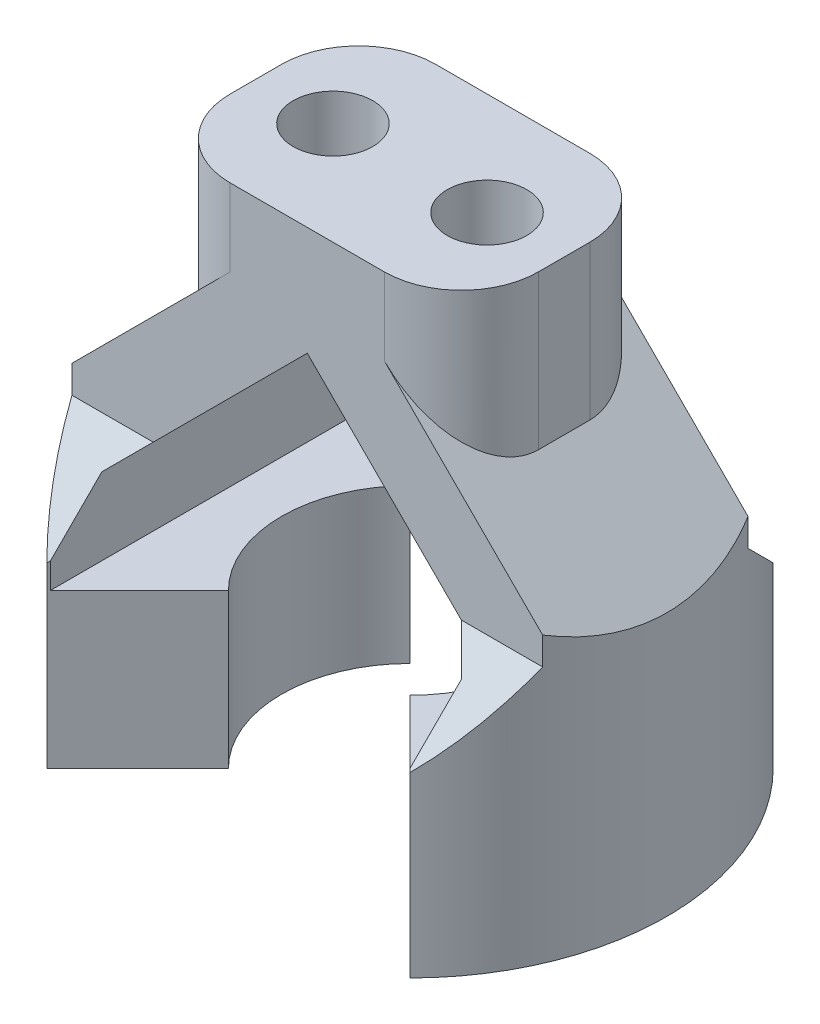
ISO-10303-21;
HEADER;
FILE_DESCRIPTION(('STEP AP214'),'2;1');
FILE_NAME('part.step','',(''),(''),'','','');
FILE_SCHEMA(('AUTOMOTIVE_DESIGN { 1 0 10303 214 1 1 1 1 }'));
ENDSEC;
DATA;
#1=APPLICATION_CONTEXT('core data for automotive mechanical design processes');
#2=APPLICATION_PROTOCOL_DEFINITION('international standard','automotive_design',2000,#1);
#3=PRODUCT_CONTEXT('',#1,'mechanical');
#4=PRODUCT('Part','Part','',(#3));
#5=PRODUCT_RELATED_PRODUCT_CATEGORY('part','',(#4));
#6=PRODUCT_DEFINITION_FORMATION('','',#4);
#7=PRODUCT_DEFINITION_CONTEXT('part definition',#1,'design');
#8=PRODUCT_DEFINITION('design','',#6,#7);
#9=PRODUCT_DEFINITION_SHAPE('','',#8);
#10=(LENGTH_UNIT() NAMED_UNIT(*) SI_UNIT(.MILLI.,.METRE.));
#11=(NAMED_UNIT(*) PLANE_ANGLE_UNIT() SI_UNIT($,.RADIAN.));
#12=(NAMED_UNIT(*) SI_UNIT($,.STERADIAN.) SOLID_ANGLE_UNIT());
#13=UNCERTAINTY_MEASURE_WITH_UNIT(LENGTH_MEASURE(1.E-05),#10,'distance_accuracy_value','');
#14=(GEOMETRIC_REPRESENTATION_CONTEXT(3) GLOBAL_UNCERTAINTY_ASSIGNED_CONTEXT((#13)) GLOBAL_UNIT_ASSIGNED_CONTEXT((#10,
#11,#12)) REPRESENTATION_CONTEXT('',''));
#15=CARTESIAN_POINT('',(0.,0.,0.));
#16=DIRECTION('',(0.,0.,1.));
#17=DIRECTION('',(1.,0.,0.));
#18=AXIS2_PLACEMENT_3D('',#15,#16,#17);
#19=CARTESIAN_POINT('',(0.,6.,0.));
#20=DIRECTION('',(0.,1.,0.));
#21=DIRECTION('',(0.,0.,1.));
#22=AXIS2_PLACEMENT_3D('',#19,#20,#21);
#23=PLANE('',#22);
#24=CARTESIAN_POINT('',(0.,6.,0.));
#25=DIRECTION('',(0.,1.,0.));
#26=DIRECTION('',(0.,0.,1.));
#27=AXIS2_PLACEMENT_3D('',#24,#25,#26);
#28=CIRCLE('',#27,5.);
#29=CARTESIAN_POINT('',(-3.53553390593274,6.,-3.53553390593273));
#30=VERTEX_POINT('',#29);
#31=CARTESIAN_POINT('',(-3.53553390593274,6.,3.53553390593273));
#32=VERTEX_POINT('',#31);
#33=EDGE_CURVE('E389',#30,#32,#28,.T.);
#34=ORIENTED_EDGE('',*,*,#33,.F.);
#35=DIRECTION('',(-0.707106781186549,0.,-0.707106781186546));
#36=VECTOR('',#35,1.);
#37=CARTESIAN_POINT('',(0.,6.,0.));
#38=LINE('',#37,#36);
#39=CARTESIAN_POINT('',(-7.,6.,-6.99999999999998));
#40=VERTEX_POINT('',#39);
#41=EDGE_CURVE('E582',#30,#40,#38,.T.);
#42=ORIENTED_EDGE('',*,*,#41,.T.);
#43=DIRECTION('',(0.,0.,-1.));
#44=VECTOR('',#43,1.);
#45=CARTESIAN_POINT('',(-7.,6.,4.));
#46=LINE('',#45,#44);
#47=CARTESIAN_POINT('',(-7.,6.,6.99999999999998));
#48=VERTEX_POINT('',#47);
#49=EDGE_CURVE('E257',#48,#40,#46,.T.);
#50=ORIENTED_EDGE('',*,*,#49,.F.);
#51=DIRECTION('',(-0.707106781186549,0.,0.707106781186546));
#52=VECTOR('',#51,1.);
#53=CARTESIAN_POINT('',(0.,6.,0.));
#54=LINE('',#53,#52);
#55=EDGE_CURVE('E469',#32,#48,#54,.T.);
#56=ORIENTED_EDGE('',*,*,#55,.F.);
#57=EDGE_LOOP('',(#34,#42,#50,#56));
#58=FACE_BOUND('',#57,.T.);
#59=ADVANCED_FACE('F47',(#58),#23,.T.);
#60=CARTESIAN_POINT('',(0.,0.,0.));
#61=DIRECTION('',(0.,1.,0.));
#62=DIRECTION('',(0.,0.,1.));
#63=AXIS2_PLACEMENT_3D('',#60,#61,#62);
#64=PLANE('',#63);
#65=DIRECTION('',(-0.707106781186549,0.,-0.707106781186546));
#66=VECTOR('',#65,1.);
#67=CARTESIAN_POINT('',(0.,0.,0.));
#68=LINE('',#67,#66);
#69=CARTESIAN_POINT('',(-3.53553390593274,0.,-3.53553390593273));
#70=VERTEX_POINT('',#69);
#71=CARTESIAN_POINT('',(-7.07106781186549,0.,-7.07106781186546));
#72=VERTEX_POINT('',#71);
#73=EDGE_CURVE('E583',#70,#72,#68,.T.);
#74=ORIENTED_EDGE('',*,*,#73,.F.);
#75=CARTESIAN_POINT('',(0.,0.,0.));
#76=DIRECTION('',(0.,1.,0.));
#77=DIRECTION('',(0.,0.,1.));
#78=AXIS2_PLACEMENT_3D('',#75,#76,#77);
#79=CIRCLE('',#78,5.);
#80=CARTESIAN_POINT('',(-3.53553390593274,0.,3.53553390593273));
#81=VERTEX_POINT('',#80);
#82=EDGE_CURVE('E383',#70,#81,#79,.T.);
#83=ORIENTED_EDGE('',*,*,#82,.T.);
#84=DIRECTION('',(-0.707106781186549,0.,0.707106781186546));
#85=VECTOR('',#84,1.);
#86=CARTESIAN_POINT('',(0.,0.,0.));
#87=LINE('',#86,#85);
#88=CARTESIAN_POINT('',(-7.07106781186549,0.,7.07106781186546));
#89=VERTEX_POINT('',#88);
#90=EDGE_CURVE('E468',#81,#89,#87,.T.);
#91=ORIENTED_EDGE('',*,*,#90,.T.);
#92=CARTESIAN_POINT('',(0.,0.,0.));
#93=DIRECTION('',(0.,1.,0.));
#94=DIRECTION('',(0.,0.,1.));
#95=AXIS2_PLACEMENT_3D('',#92,#93,#94);
#96=CIRCLE('',#95,10.);
#97=EDGE_CURVE('E388',#72,#89,#96,.T.);
#98=ORIENTED_EDGE('',*,*,#97,.F.);
#99=EDGE_LOOP('',(#74,#83,#91,#98));
#100=FACE_BOUND('',#99,.T.);
#101=ADVANCED_FACE('F619',(#100),#64,.F.);
#102=CARTESIAN_POINT('',(0.,6.,0.));
#103=DIRECTION('',(0.,-1.,0.));
#104=DIRECTION('',(0.,0.,-1.));
#105=AXIS2_PLACEMENT_3D('',#102,#103,#104);
#106=CYLINDRICAL_SURFACE('',#105,10.);
#107=DIRECTION('',(0.,1.,0.));
#108=VECTOR('',#107,1.);
#109=CARTESIAN_POINT('',(-7.07106781186549,0.,-7.07106781186546));
#110=LINE('',#109,#108);
#111=CARTESIAN_POINT('',(-7.07106781186549,6.92893218813458,-7.07106781186546));
#112=VERTEX_POINT('',#111);
#113=EDGE_CURVE('E243',#72,#112,#110,.T.);
#114=ORIENTED_EDGE('',*,*,#113,.F.);
#115=ORIENTED_EDGE('',*,*,#97,.T.);
#116=DIRECTION('',(0.,1.,0.));
#117=VECTOR('',#116,1.);
#118=CARTESIAN_POINT('',(-7.07106781186549,0.,7.07106781186546));
#119=LINE('',#118,#117);
#120=CARTESIAN_POINT('',(-7.07106781186549,6.9289321881346,7.07106781186546));
#121=VERTEX_POINT('',#120);
#122=EDGE_CURVE('E483',#89,#121,#119,.T.);
#123=ORIENTED_EDGE('',*,*,#122,.T.);
#124=CARTESIAN_POINT('',(0.,14.,0.));
#125=DIRECTION('',(0.,0.707106781186551,0.707106781186544));
#126=DIRECTION('',(0.,-0.707106781186544,0.707106781186551));
#127=AXIS2_PLACEMENT_3D('',#124,#125,#126);
#128=ELLIPSE('',#127,14.1421356237309,10.);
#129=CARTESIAN_POINT('',(-9.16515138991168,10.,4.));
#130=VERTEX_POINT('',#129);
#131=EDGE_CURVE('E435',#121,#130,#128,.F.);
#132=ORIENTED_EDGE('',*,*,#131,.T.);
#133=DIRECTION('',(0.,-1.,0.));
#134=VECTOR('',#133,1.);
#135=CARTESIAN_POINT('',(-9.16515138991168,20.2436406871193,4.));
#136=LINE('',#135,#134);
#137=CARTESIAN_POINT('',(-9.16515138991168,11.0774892972076,4.));
#138=VERTEX_POINT('',#137);
#139=EDGE_CURVE('E482',#138,#130,#136,.T.);
#140=ORIENTED_EDGE('',*,*,#139,.F.);
#141=CARTESIAN_POINT('',(0.,20.2426406871193,0.));
#142=DIRECTION('',(-0.707106781186547,0.707106781186547,0.));
#143=DIRECTION('',(-0.707106781186548,-0.707106781186548,0.));
#144=AXIS2_PLACEMENT_3D('',#141,#142,#143);
#145=ELLIPSE('',#144,14.142135623731,10.);
#146=CARTESIAN_POINT('',(-9.16515138991168,11.0774892972076,-4.));
#147=VERTEX_POINT('',#146);
#148=EDGE_CURVE('E503',#147,#138,#145,.T.);
#149=ORIENTED_EDGE('',*,*,#148,.F.);
#150=DIRECTION('',(0.,-1.,0.));
#151=VECTOR('',#150,1.);
#152=CARTESIAN_POINT('',(-9.16515138991168,20.2436406871193,-4.));
#153=LINE('',#152,#151);
#154=CARTESIAN_POINT('',(-9.16515138991168,10.0000000000001,-4.));
#155=VERTEX_POINT('',#154);
#156=EDGE_CURVE('E497',#147,#155,#153,.T.);
#157=ORIENTED_EDGE('',*,*,#156,.T.);
#158=CARTESIAN_POINT('',(0.,14.0000000000001,0.));
#159=DIRECTION('',(0.,-0.707106781186544,0.707106781186551));
#160=DIRECTION('',(0.,-0.707106781186551,-0.707106781186544));
#161=AXIS2_PLACEMENT_3D('',#158,#159,#160);
#162=ELLIPSE('',#161,14.142135623731,10.);
#163=EDGE_CURVE('E266',#155,#112,#162,.T.);
#164=ORIENTED_EDGE('',*,*,#163,.T.);
#165=EDGE_LOOP('',(#114,#115,#123,#132,#140,#149,#157,#164));
#166=FACE_BOUND('',#165,.T.);
#167=ADVANCED_FACE('F552',(#166),#106,.T.);
#168=CARTESIAN_POINT('',(0.,6.,0.));
#169=DIRECTION('',(0.,-1.,0.));
#170=DIRECTION('',(0.,0.,-1.));
#171=AXIS2_PLACEMENT_3D('',#168,#169,#170);
#172=CYLINDRICAL_SURFACE('',#171,5.);
#173=ORIENTED_EDGE('',*,*,#82,.F.);
#174=DIRECTION('',(0.,1.,0.));
#175=VECTOR('',#174,1.);
#176=CARTESIAN_POINT('',(-3.53553390593274,0.,-3.53553390593273));
#177=LINE('',#176,#175);
#178=EDGE_CURVE('E591',#70,#30,#177,.T.);
#179=ORIENTED_EDGE('',*,*,#178,.T.);
#180=ORIENTED_EDGE('',*,*,#33,.T.);
#181=DIRECTION('',(0.,1.,0.));
#182=VECTOR('',#181,1.);
#183=CARTESIAN_POINT('',(-3.53553390593274,0.,3.53553390593273));
#184=LINE('',#183,#182);
#185=EDGE_CURVE('E486',#81,#32,#184,.T.);
#186=ORIENTED_EDGE('',*,*,#185,.F.);
#187=EDGE_LOOP('',(#173,#179,#180,#186));
#188=FACE_BOUND('',#187,.T.);
#189=ADVANCED_FACE('F609',(#188),#172,.F.);
#190=CARTESIAN_POINT('',(-7.,0.,4.));
#191=DIRECTION('',(-1.,0.,0.));
#192=DIRECTION('',(0.,-1.,0.));
#193=AXIS2_PLACEMENT_3D('',#190,#191,#192);
#194=PLANE('',#193);
#195=DIRECTION('',(0.,-1.,0.));
#196=VECTOR('',#195,1.);
#197=CARTESIAN_POINT('',(-7.,20.2436406871193,-6.99999999999998));
#198=LINE('',#197,#196);
#199=CARTESIAN_POINT('',(-7.,7.00000000000006,-6.99999999999998));
#200=VERTEX_POINT('',#199);
#201=EDGE_CURVE('E240',#200,#40,#198,.T.);
#202=ORIENTED_EDGE('',*,*,#201,.F.);
#203=DIRECTION('',(0.,0.707106781186551,0.707106781186544));
#204=VECTOR('',#203,1.);
#205=CARTESIAN_POINT('',(-7.,8.99999999999998,-5.00000000000008));
#206=LINE('',#205,#204);
#207=CARTESIAN_POINT('',(-7.,9.,-5.00000000000006));
#208=VERTEX_POINT('',#207);
#209=EDGE_CURVE('E253',#200,#208,#206,.T.);
#210=ORIENTED_EDGE('',*,*,#209,.T.);
#211=DIRECTION('',(0.,0.,-1.));
#212=VECTOR('',#211,1.);
#213=CARTESIAN_POINT('',(-7.,9.,4.));
#214=LINE('',#213,#212);
#215=CARTESIAN_POINT('',(-7.,9.,5.00000000000004));
#216=VERTEX_POINT('',#215);
#217=EDGE_CURVE('E378',#216,#208,#214,.T.);
#218=ORIENTED_EDGE('',*,*,#217,.F.);
#219=DIRECTION('',(0.,0.707106781186544,-0.707106781186551));
#220=VECTOR('',#219,1.);
#221=CARTESIAN_POINT('',(-7.,5.00000000000006,9.00000000000001));
#222=LINE('',#221,#220);
#223=CARTESIAN_POINT('',(-7.,7.00000000000007,6.99999999999998));
#224=VERTEX_POINT('',#223);
#225=EDGE_CURVE('E272',#216,#224,#222,.F.);
#226=ORIENTED_EDGE('',*,*,#225,.T.);
#227=DIRECTION('',(0.,-1.,0.));
#228=VECTOR('',#227,1.);
#229=CARTESIAN_POINT('',(-7.,20.2436406871193,6.99999999999998));
#230=LINE('',#229,#228);
#231=EDGE_CURVE('E444',#224,#48,#230,.T.);
#232=ORIENTED_EDGE('',*,*,#231,.T.);
#233=ORIENTED_EDGE('',*,*,#49,.T.);
#234=EDGE_LOOP('',(#202,#210,#218,#226,#232,#233));
#235=FACE_BOUND('',#234,.T.);
#236=ADVANCED_FACE('F252',(#235),#194,.F.);
#237=CARTESIAN_POINT('',(0.,10.0000000000001,-4.));
#238=DIRECTION('',(0.,-0.707106781186544,0.707106781186551));
#239=DIRECTION('',(-1.,0.,0.));
#240=AXIS2_PLACEMENT_3D('',#237,#238,#239);
#241=PLANE('',#240);
#242=DIRECTION('',(0.577350269189625,0.577350269189629,0.577350269189623));
#243=VECTOR('',#242,1.);
#244=CARTESIAN_POINT('',(2.08121356237307,16.0812135623732,2.08121356237306));
#245=LINE('',#244,#243);
#246=EDGE_CURVE('E237',#112,#200,#245,.T.);
#247=ORIENTED_EDGE('',*,*,#246,.F.);
#248=ORIENTED_EDGE('',*,*,#163,.F.);
#249=DIRECTION('',(-1.,0.,0.));
#250=VECTOR('',#249,1.);
#251=CARTESIAN_POINT('',(0.,10.0000000000001,-4.));
#252=LINE('',#251,#250);
#253=CARTESIAN_POINT('',(-5.99999999999993,10.0000000000001,-4.));
#254=VERTEX_POINT('',#253);
#255=EDGE_CURVE('E398',#254,#155,#252,.T.);
#256=ORIENTED_EDGE('',*,*,#255,.F.);
#257=DIRECTION('',(0.577350269189628,0.577350269189628,0.577350269189622));
#258=VECTOR('',#257,1.);
#259=CARTESIAN_POINT('',(-4.66666666666666,11.3333333333333,-2.66666666666675));
#260=LINE('',#259,#258);
#261=EDGE_CURVE('E264',#208,#254,#260,.T.);
#262=ORIENTED_EDGE('',*,*,#261,.F.);
#263=ORIENTED_EDGE('',*,*,#209,.F.);
#264=EDGE_LOOP('',(#247,#248,#256,#262,#263));
#265=FACE_BOUND('',#264,.T.);
#266=ADVANCED_FACE('F262',(#265),#241,.F.);
#267=DIRECTION('',(0.707106781186549,0.,-0.707106781186546));
#268=VECTOR('',#267,1.);
#269=CARTESIAN_POINT('',(0.,6.,0.));
#270=LINE('',#269,#268);
#271=CARTESIAN_POINT('',(3.53553390593274,6.,-3.53553390593273));
#272=VERTEX_POINT('',#271);
#273=CARTESIAN_POINT('',(7.,6.,-6.99999999999998));
#274=VERTEX_POINT('',#273);
#275=EDGE_CURVE('E587',#272,#274,#270,.T.);
#276=ORIENTED_EDGE('',*,*,#275,.F.);
#277=CARTESIAN_POINT('',(3.53553390593274,6.,3.53553390593273));
#278=VERTEX_POINT('',#277);
#279=EDGE_CURVE('E384',#278,#272,#28,.T.);
#280=ORIENTED_EDGE('',*,*,#279,.F.);
#281=DIRECTION('',(0.707106781186549,0.,0.707106781186546));
#282=VECTOR('',#281,1.);
#283=CARTESIAN_POINT('',(0.,6.,0.));
#284=LINE('',#283,#282);
#285=CARTESIAN_POINT('',(7.,6.,6.99999999999998));
#286=VERTEX_POINT('',#285);
#287=EDGE_CURVE('E459',#278,#286,#284,.T.);
#288=ORIENTED_EDGE('',*,*,#287,.T.);
#289=DIRECTION('',(0.,0.,-1.));
#290=VECTOR('',#289,1.);
#291=CARTESIAN_POINT('',(7.,6.,4.));
#292=LINE('',#291,#290);
#293=EDGE_CURVE('E367',#286,#274,#292,.T.);
#294=ORIENTED_EDGE('',*,*,#293,.T.);
#295=EDGE_LOOP('',(#276,#280,#288,#294));
#296=FACE_BOUND('',#295,.T.);
#297=ADVANCED_FACE('F642',(#296),#23,.T.);
#298=CARTESIAN_POINT('',(3.53553390593274,0.,3.53553390593273));
#299=VERTEX_POINT('',#298);
#300=CARTESIAN_POINT('',(3.53553390593274,0.,-3.53553390593273));
#301=VERTEX_POINT('',#300);
#302=EDGE_CURVE('E390',#299,#301,#79,.T.);
#303=ORIENTED_EDGE('',*,*,#302,.T.);
#304=DIRECTION('',(0.707106781186549,0.,-0.707106781186546));
#305=VECTOR('',#304,1.);
#306=CARTESIAN_POINT('',(0.,0.,0.));
#307=LINE('',#306,#305);
#308=CARTESIAN_POINT('',(7.07106781186549,0.,-7.07106781186546));
#309=VERTEX_POINT('',#308);
#310=EDGE_CURVE('E586',#301,#309,#307,.T.);
#311=ORIENTED_EDGE('',*,*,#310,.T.);
#312=CARTESIAN_POINT('',(7.07106781186549,0.,7.07106781186546));
#313=VERTEX_POINT('',#312);
#314=EDGE_CURVE('E394',#313,#309,#96,.T.);
#315=ORIENTED_EDGE('',*,*,#314,.F.);
#316=DIRECTION('',(0.707106781186549,0.,0.707106781186546));
#317=VECTOR('',#316,1.);
#318=CARTESIAN_POINT('',(0.,0.,0.));
#319=LINE('',#318,#317);
#320=EDGE_CURVE('E465',#299,#313,#319,.T.);
#321=ORIENTED_EDGE('',*,*,#320,.F.);
#322=EDGE_LOOP('',(#303,#311,#315,#321));
#323=FACE_BOUND('',#322,.T.);
#324=ADVANCED_FACE('F632',(#323),#64,.F.);
#325=ORIENTED_EDGE('',*,*,#314,.T.);
#326=DIRECTION('',(0.,1.,0.));
#327=VECTOR('',#326,1.);
#328=CARTESIAN_POINT('',(7.07106781186549,0.,-7.07106781186546));
#329=LINE('',#328,#327);
#330=CARTESIAN_POINT('',(7.07106781186549,6.92893218813458,-7.07106781186546));
#331=VERTEX_POINT('',#330);
#332=EDGE_CURVE('E598',#309,#331,#329,.T.);
#333=ORIENTED_EDGE('',*,*,#332,.T.);
#334=CARTESIAN_POINT('',(0.,14.0000000000001,0.));
#335=DIRECTION('',(0.,-0.707106781186544,0.707106781186551));
#336=DIRECTION('',(0.,-0.707106781186551,-0.707106781186544));
#337=AXIS2_PLACEMENT_3D('',#334,#335,#336);
#338=ELLIPSE('',#337,14.142135623731,10.);
#339=CARTESIAN_POINT('',(9.16515138991168,10.0000000000001,-4.));
#340=VERTEX_POINT('',#339);
#341=EDGE_CURVE('E422',#331,#340,#338,.T.);
#342=ORIENTED_EDGE('',*,*,#341,.T.);
#343=DIRECTION('',(0.,-1.,0.));
#344=VECTOR('',#343,1.);
#345=CARTESIAN_POINT('',(9.16515138991168,20.2436406871193,-4.));
#346=LINE('',#345,#344);
#347=CARTESIAN_POINT('',(9.16515138991168,11.0774892972076,-4.));
#348=VERTEX_POINT('',#347);
#349=EDGE_CURVE('E351',#340,#348,#346,.F.);
#350=ORIENTED_EDGE('',*,*,#349,.T.);
#351=CARTESIAN_POINT('',(0.,20.2426406871193,0.));
#352=DIRECTION('',(0.707106781186547,0.707106781186547,0.));
#353=DIRECTION('',(0.707106781186548,-0.707106781186548,0.));
#354=AXIS2_PLACEMENT_3D('',#351,#352,#353);
#355=ELLIPSE('',#354,14.142135623731,10.);
#356=CARTESIAN_POINT('',(9.16515138991168,11.0774892972076,4.));
#357=VERTEX_POINT('',#356);
#358=EDGE_CURVE('E344',#357,#348,#355,.T.);
#359=ORIENTED_EDGE('',*,*,#358,.F.);
#360=DIRECTION('',(0.,-1.,0.));
#361=VECTOR('',#360,1.);
#362=CARTESIAN_POINT('',(9.16515138991168,20.2436406871193,4.));
#363=LINE('',#362,#361);
#364=CARTESIAN_POINT('',(9.16515138991168,10.,4.));
#365=VERTEX_POINT('',#364);
#366=EDGE_CURVE('E493',#365,#357,#363,.F.);
#367=ORIENTED_EDGE('',*,*,#366,.F.);
#368=CARTESIAN_POINT('',(0.,14.,0.));
#369=DIRECTION('',(0.,0.707106781186551,0.707106781186544));
#370=DIRECTION('',(0.,-0.707106781186544,0.707106781186551));
#371=AXIS2_PLACEMENT_3D('',#368,#369,#370);
#372=ELLIPSE('',#371,14.1421356237309,10.);
#373=CARTESIAN_POINT('',(7.07106781186549,6.9289321881346,7.07106781186546));
#374=VERTEX_POINT('',#373);
#375=EDGE_CURVE('E425',#365,#374,#372,.F.);
#376=ORIENTED_EDGE('',*,*,#375,.T.);
#377=DIRECTION('',(0.,1.,0.));
#378=VECTOR('',#377,1.);
#379=CARTESIAN_POINT('',(7.07106781186549,0.,7.07106781186546));
#380=LINE('',#379,#378);
#381=EDGE_CURVE('E479',#313,#374,#380,.T.);
#382=ORIENTED_EDGE('',*,*,#381,.F.);
#383=EDGE_LOOP('',(#325,#333,#342,#350,#359,#367,#376,#382));
#384=FACE_BOUND('',#383,.T.);
#385=ADVANCED_FACE('F534',(#384),#106,.T.);
#386=DIRECTION('',(0.,1.,0.));
#387=VECTOR('',#386,1.);
#388=CARTESIAN_POINT('',(3.53553390593274,0.,-3.53553390593273));
#389=LINE('',#388,#387);
#390=EDGE_CURVE('E601',#301,#272,#389,.T.);
#391=ORIENTED_EDGE('',*,*,#390,.F.);
#392=ORIENTED_EDGE('',*,*,#302,.F.);
#393=DIRECTION('',(0.,1.,0.));
#394=VECTOR('',#393,1.);
#395=CARTESIAN_POINT('',(3.53553390593274,0.,3.53553390593273));
#396=LINE('',#395,#394);
#397=EDGE_CURVE('E473',#299,#278,#396,.T.);
#398=ORIENTED_EDGE('',*,*,#397,.T.);
#399=ORIENTED_EDGE('',*,*,#279,.T.);
#400=EDGE_LOOP('',(#391,#392,#398,#399));
#401=FACE_BOUND('',#400,.T.);
#402=ADVANCED_FACE('F639',(#401),#172,.F.);
#403=CARTESIAN_POINT('',(7.,0.,4.));
#404=DIRECTION('',(1.,0.,0.));
#405=DIRECTION('',(0.,1.,0.));
#406=AXIS2_PLACEMENT_3D('',#403,#404,#405);
#407=PLANE('',#406);
#408=DIRECTION('',(0.,-0.707106781186551,-0.707106781186544));
#409=VECTOR('',#408,1.);
#410=CARTESIAN_POINT('',(7.,8.99999999999998,-5.00000000000008));
#411=LINE('',#410,#409);
#412=CARTESIAN_POINT('',(7.,9.,-5.00000000000006));
#413=VERTEX_POINT('',#412);
#414=CARTESIAN_POINT('',(7.,7.00000000000006,-6.99999999999998));
#415=VERTEX_POINT('',#414);
#416=EDGE_CURVE('E418',#413,#415,#411,.T.);
#417=ORIENTED_EDGE('',*,*,#416,.T.);
#418=DIRECTION('',(0.,-1.,0.));
#419=VECTOR('',#418,1.);
#420=CARTESIAN_POINT('',(7.,20.2436406871193,-6.99999999999998));
#421=LINE('',#420,#419);
#422=EDGE_CURVE('E578',#415,#274,#421,.T.);
#423=ORIENTED_EDGE('',*,*,#422,.T.);
#424=ORIENTED_EDGE('',*,*,#293,.F.);
#425=DIRECTION('',(0.,-1.,0.));
#426=VECTOR('',#425,1.);
#427=CARTESIAN_POINT('',(7.,20.2436406871193,6.99999999999998));
#428=LINE('',#427,#426);
#429=CARTESIAN_POINT('',(7.,7.00000000000008,6.99999999999998));
#430=VERTEX_POINT('',#429);
#431=EDGE_CURVE('E461',#430,#286,#428,.T.);
#432=ORIENTED_EDGE('',*,*,#431,.F.);
#433=DIRECTION('',(0.,-0.707106781186544,0.707106781186551));
#434=VECTOR('',#433,1.);
#435=CARTESIAN_POINT('',(7.,5.00000000000006,9.00000000000001));
#436=LINE('',#435,#434);
#437=CARTESIAN_POINT('',(7.,9.,5.00000000000004));
#438=VERTEX_POINT('',#437);
#439=EDGE_CURVE('E429',#430,#438,#436,.F.);
#440=ORIENTED_EDGE('',*,*,#439,.T.);
#441=DIRECTION('',(0.,0.,-1.));
#442=VECTOR('',#441,1.);
#443=CARTESIAN_POINT('',(7.,9.,4.));
#444=LINE('',#443,#442);
#445=EDGE_CURVE('E371',#438,#413,#444,.T.);
#446=ORIENTED_EDGE('',*,*,#445,.T.);
#447=EDGE_LOOP('',(#417,#423,#424,#432,#440,#446));
#448=FACE_BOUND('',#447,.T.);
#449=ADVANCED_FACE('F645',(#448),#407,.F.);
#450=CARTESIAN_POINT('',(0.,6.,8.00000000000007));
#451=DIRECTION('',(0.,0.707106781186551,0.707106781186544));
#452=DIRECTION('',(1.,0.,0.));
#453=AXIS2_PLACEMENT_3D('',#450,#451,#452);
#454=PLANE('',#453);
#455=DIRECTION('',(0.577350269189629,-0.577350269189621,0.577350269189627));
#456=VECTOR('',#455,1.);
#457=CARTESIAN_POINT('',(-2.0812135623731,16.0812135623731,-2.08121356237309));
#458=LINE('',#457,#456);
#459=EDGE_CURVE('E455',#374,#430,#458,.F.);
#460=ORIENTED_EDGE('',*,*,#459,.F.);
#461=ORIENTED_EDGE('',*,*,#375,.F.);
#462=DIRECTION('',(1.,0.,0.));
#463=VECTOR('',#462,1.);
#464=CARTESIAN_POINT('',(9.16515138991168,10.,4.));
#465=LINE('',#464,#463);
#466=CARTESIAN_POINT('',(5.99999999999997,10.,4.));
#467=VERTEX_POINT('',#466);
#468=EDGE_CURVE('E410',#467,#365,#465,.T.);
#469=ORIENTED_EDGE('',*,*,#468,.F.);
#470=DIRECTION('',(0.577350269189624,-0.577350269189624,0.57735026918963));
#471=VECTOR('',#470,1.);
#472=CARTESIAN_POINT('',(7.33333333333331,8.66666666666669,5.33333333333336));
#473=LINE('',#472,#471);
#474=EDGE_CURVE('E432',#438,#467,#473,.F.);
#475=ORIENTED_EDGE('',*,*,#474,.F.);
#476=ORIENTED_EDGE('',*,*,#439,.F.);
#477=EDGE_LOOP('',(#460,#461,#469,#475,#476));
#478=FACE_BOUND('',#477,.T.);
#479=ADVANCED_FACE('F626',(#478),#454,.T.);
#480=CARTESIAN_POINT('',(-10.1213203435596,10.1213203435596,4.));
#481=DIRECTION('',(-0.707106781186547,0.707106781186547,0.));
#482=DIRECTION('',(-0.707106781186548,-0.707106781186548,0.));
#483=AXIS2_PLACEMENT_3D('',#480,#481,#482);
#484=PLANE('',#483);
#485=DIRECTION('',(0.707106781186548,0.707106781186548,0.));
#486=VECTOR('',#485,1.);
#487=CARTESIAN_POINT('',(-10.1213203435596,10.1213203435596,4.));
#488=LINE('',#487,#486);
#489=CARTESIAN_POINT('',(-3.00000000000001,17.2426406871193,4.));
#490=VERTEX_POINT('',#489);
#491=EDGE_CURVE('E513',#138,#490,#488,.T.);
#492=ORIENTED_EDGE('',*,*,#491,.T.);
#493=CARTESIAN_POINT('',(-3.00000000000001,17.2426406871193,1.));
#494=DIRECTION('',(-0.707106781186547,0.707106781186547,0.));
#495=DIRECTION('',(0.707106781186548,0.707106781186548,0.));
#496=AXIS2_PLACEMENT_3D('',#493,#494,#495);
#497=ELLIPSE('',#496,4.24264068711928,3.);
#498=CARTESIAN_POINT('',(-6.00000000000001,14.2426406871193,1.));
#499=VERTEX_POINT('',#498);
#500=EDGE_CURVE('E11',#490,#499,#497,.F.);
#501=ORIENTED_EDGE('',*,*,#500,.T.);
#502=DIRECTION('',(0.,0.,-1.));
#503=VECTOR('',#502,1.);
#504=CARTESIAN_POINT('',(-6.00000000000001,14.2426406871193,4.));
#505=LINE('',#504,#503);
#506=CARTESIAN_POINT('',(-6.00000000000001,14.2426406871193,-1.));
#507=VERTEX_POINT('',#506);
#508=EDGE_CURVE('E329',#499,#507,#505,.T.);
#509=ORIENTED_EDGE('',*,*,#508,.T.);
#510=CARTESIAN_POINT('',(-3.00000000000001,17.2426406871193,-1.));
#511=DIRECTION('',(-0.707106781186547,0.707106781186547,0.));
#512=DIRECTION('',(-0.707106781186548,-0.707106781186548,0.));
#513=AXIS2_PLACEMENT_3D('',#510,#511,#512);
#514=ELLIPSE('',#513,4.24264068711928,3.);
#515=CARTESIAN_POINT('',(-3.00000000000001,17.2426406871193,-4.));
#516=VERTEX_POINT('',#515);
#517=EDGE_CURVE('E56',#507,#516,#514,.F.);
#518=ORIENTED_EDGE('',*,*,#517,.T.);
#519=DIRECTION('',(0.707106781186548,0.707106781186548,0.));
#520=VECTOR('',#519,1.);
#521=CARTESIAN_POINT('',(-10.1213203435596,10.1213203435596,-4.));
#522=LINE('',#521,#520);
#523=EDGE_CURVE('E328',#147,#516,#522,.T.);
#524=ORIENTED_EDGE('',*,*,#523,.F.);
#525=ORIENTED_EDGE('',*,*,#148,.T.);
#526=EDGE_LOOP('',(#492,#501,#509,#518,#524,#525));
#527=FACE_BOUND('',#526,.T.);
#528=ADVANCED_FACE('F327',(#527),#484,.T.);
#529=CARTESIAN_POINT('',(10.1213203435596,10.1213203435596,4.));
#530=DIRECTION('',(0.707106781186547,0.707106781186547,0.));
#531=DIRECTION('',(-0.707106781186548,0.707106781186548,0.));
#532=AXIS2_PLACEMENT_3D('',#529,#530,#531);
#533=PLANE('',#532);
#534=DIRECTION('',(0.707106781186548,-0.707106781186548,0.));
#535=VECTOR('',#534,1.);
#536=CARTESIAN_POINT('',(10.1213203435596,10.1213203435596,-4.));
#537=LINE('',#536,#535);
#538=CARTESIAN_POINT('',(2.99999999999999,17.2426406871193,-4.));
#539=VERTEX_POINT('',#538);
#540=EDGE_CURVE('E363',#539,#348,#537,.T.);
#541=ORIENTED_EDGE('',*,*,#540,.F.);
#542=CARTESIAN_POINT('',(2.99999999999999,17.2426406871193,-1.));
#543=DIRECTION('',(0.707106781186547,0.707106781186547,0.));
#544=DIRECTION('',(0.707106781186548,-0.707106781186548,0.));
#545=AXIS2_PLACEMENT_3D('',#542,#543,#544);
#546=ELLIPSE('',#545,4.24264068711929,3.);
#547=CARTESIAN_POINT('',(5.99999999999999,14.2426406871193,-1.));
#548=VERTEX_POINT('',#547);
#549=EDGE_CURVE('E316',#539,#548,#546,.F.);
#550=ORIENTED_EDGE('',*,*,#549,.T.);
#551=DIRECTION('',(0.,0.,1.));
#552=VECTOR('',#551,1.);
#553=CARTESIAN_POINT('',(5.99999999999999,14.2426406871193,4.));
#554=LINE('',#553,#552);
#555=CARTESIAN_POINT('',(5.99999999999999,14.2426406871193,1.));
#556=VERTEX_POINT('',#555);
#557=EDGE_CURVE('E563',#548,#556,#554,.T.);
#558=ORIENTED_EDGE('',*,*,#557,.T.);
#559=CARTESIAN_POINT('',(2.99999999999999,17.2426406871193,1.));
#560=DIRECTION('',(0.707106781186547,0.707106781186547,0.));
#561=DIRECTION('',(-0.707106781186548,0.707106781186548,0.));
#562=AXIS2_PLACEMENT_3D('',#559,#560,#561);
#563=ELLIPSE('',#562,4.24264068711929,3.);
#564=CARTESIAN_POINT('',(2.99999999999999,17.2426406871193,4.));
#565=VERTEX_POINT('',#564);
#566=EDGE_CURVE('E319',#556,#565,#563,.F.);
#567=ORIENTED_EDGE('',*,*,#566,.T.);
#568=DIRECTION('',(0.707106781186548,-0.707106781186548,0.));
#569=VECTOR('',#568,1.);
#570=CARTESIAN_POINT('',(10.1213203435596,10.1213203435596,4.));
#571=LINE('',#570,#569);
#572=EDGE_CURVE('E354',#565,#357,#571,.T.);
#573=ORIENTED_EDGE('',*,*,#572,.T.);
#574=ORIENTED_EDGE('',*,*,#358,.T.);
#575=EDGE_LOOP('',(#541,#550,#558,#567,#573,#574));
#576=FACE_BOUND('',#575,.T.);
#577=ADVANCED_FACE('F526',(#576),#533,.T.);
#578=CARTESIAN_POINT('',(0.,20.2426406871193,4.));
#579=DIRECTION('',(0.,1.,0.));
#580=DIRECTION('',(-1.,0.,0.));
#581=AXIS2_PLACEMENT_3D('',#578,#579,#580);
#582=PLANE('',#581);
#583=CARTESIAN_POINT('',(-3.00000000000001,20.2426406871193,0.));
#584=DIRECTION('',(0.,1.,0.));
#585=DIRECTION('',(-1.,0.,0.));
#586=AXIS2_PLACEMENT_3D('',#583,#584,#585);
#587=CIRCLE('',#586,1.55);
#588=CARTESIAN_POINT('',(-4.55000000000001,20.2426406871193,0.));
#589=VERTEX_POINT('',#588);
#590=EDGE_CURVE('E1088',#589,#589,#587,.T.);
#591=ORIENTED_EDGE('',*,*,#590,.F.);
#592=EDGE_LOOP('',(#591));
#593=FACE_BOUND('',#592,.T.);
#594=CARTESIAN_POINT('',(2.99999999999999,20.2426406871193,0.));
#595=DIRECTION('',(0.,1.,0.));
#596=DIRECTION('',(-1.,0.,0.));
#597=AXIS2_PLACEMENT_3D('',#594,#595,#596);
#598=CIRCLE('',#597,1.55);
#599=CARTESIAN_POINT('',(1.44999999999999,20.2426406871193,0.));
#600=VERTEX_POINT('',#599);
#601=EDGE_CURVE('E1085',#600,#600,#598,.T.);
#602=ORIENTED_EDGE('',*,*,#601,.F.);
#603=EDGE_LOOP('',(#602));
#604=FACE_BOUND('',#603,.T.);
#605=DIRECTION('',(0.,0.,-1.));
#606=VECTOR('',#605,1.);
#607=CARTESIAN_POINT('',(5.99999999999999,20.2426406871193,4.));
#608=LINE('',#607,#606);
#609=CARTESIAN_POINT('',(5.99999999999999,20.2426406871193,1.));
#610=VERTEX_POINT('',#609);
#611=CARTESIAN_POINT('',(5.99999999999999,20.2426406871193,-1.));
#612=VERTEX_POINT('',#611);
#613=EDGE_CURVE('E259',#610,#612,#608,.T.);
#614=ORIENTED_EDGE('',*,*,#613,.T.);
#615=CARTESIAN_POINT('',(2.99999999999999,20.2426406871193,-1.));
#616=DIRECTION('',(0.,1.,0.));
#617=DIRECTION('',(-1.,0.,0.));
#618=AXIS2_PLACEMENT_3D('',#615,#616,#617);
#619=CIRCLE('',#618,3.);
#620=CARTESIAN_POINT('',(2.99999999999999,20.2426406871193,-4.));
#621=VERTEX_POINT('',#620);
#622=EDGE_CURVE('E291',#612,#621,#619,.T.);
#623=ORIENTED_EDGE('',*,*,#622,.T.);
#624=DIRECTION('',(1.,0.,0.));
#625=VECTOR('',#624,1.);
#626=CARTESIAN_POINT('',(0.,20.2426406871193,-4.));
#627=LINE('',#626,#625);
#628=CARTESIAN_POINT('',(-3.00000000000001,20.2426406871193,-4.));
#629=VERTEX_POINT('',#628);
#630=EDGE_CURVE('E336',#629,#621,#627,.T.);
#631=ORIENTED_EDGE('',*,*,#630,.F.);
#632=CARTESIAN_POINT('',(-3.00000000000001,20.2426406871193,-1.));
#633=DIRECTION('',(0.,1.,0.));
#634=DIRECTION('',(-1.,0.,0.));
#635=AXIS2_PLACEMENT_3D('',#632,#633,#634);
#636=CIRCLE('',#635,3.);
#637=CARTESIAN_POINT('',(-6.00000000000001,20.2426406871193,-1.));
#638=VERTEX_POINT('',#637);
#639=EDGE_CURVE('E285',#629,#638,#636,.T.);
#640=ORIENTED_EDGE('',*,*,#639,.T.);
#641=DIRECTION('',(0.,0.,1.));
#642=VECTOR('',#641,1.);
#643=CARTESIAN_POINT('',(-6.00000000000001,20.2426406871193,4.));
#644=LINE('',#643,#642);
#645=CARTESIAN_POINT('',(-6.00000000000001,20.2426406871193,1.));
#646=VERTEX_POINT('',#645);
#647=EDGE_CURVE('E561',#638,#646,#644,.T.);
#648=ORIENTED_EDGE('',*,*,#647,.T.);
#649=CARTESIAN_POINT('',(-3.00000000000001,20.2426406871193,1.));
#650=DIRECTION('',(0.,1.,0.));
#651=DIRECTION('',(-1.,0.,0.));
#652=AXIS2_PLACEMENT_3D('',#649,#650,#651);
#653=CIRCLE('',#652,3.);
#654=CARTESIAN_POINT('',(-3.00000000000001,20.2426406871193,4.));
#655=VERTEX_POINT('',#654);
#656=EDGE_CURVE('E282',#646,#655,#653,.T.);
#657=ORIENTED_EDGE('',*,*,#656,.T.);
#658=DIRECTION('',(1.,0.,0.));
#659=VECTOR('',#658,1.);
#660=CARTESIAN_POINT('',(0.,20.2426406871193,4.));
#661=LINE('',#660,#659);
#662=CARTESIAN_POINT('',(2.99999999999999,20.2426406871193,4.));
#663=VERTEX_POINT('',#662);
#664=EDGE_CURVE('E366',#655,#663,#661,.T.);
#665=ORIENTED_EDGE('',*,*,#664,.T.);
#666=CARTESIAN_POINT('',(2.99999999999999,20.2426406871193,1.));
#667=DIRECTION('',(0.,1.,0.));
#668=DIRECTION('',(-1.,0.,0.));
#669=AXIS2_PLACEMENT_3D('',#666,#667,#668);
#670=CIRCLE('',#669,3.);
#671=EDGE_CURVE('E288',#663,#610,#670,.T.);
#672=ORIENTED_EDGE('',*,*,#671,.T.);
#673=EDGE_LOOP('',(#614,#623,#631,#640,#648,#657,#665,#672));
#674=FACE_BOUND('',#673,.T.);
#675=ADVANCED_FACE('F341',(#593,#604,#674),#582,.T.);
#676=CARTESIAN_POINT('',(-8.,8.,4.));
#677=DIRECTION('',(-0.707106781186547,0.707106781186547,0.));
#678=DIRECTION('',(-0.707106781186548,-0.707106781186548,0.));
#679=AXIS2_PLACEMENT_3D('',#676,#677,#678);
#680=PLANE('',#679);
#681=ORIENTED_EDGE('',*,*,#217,.T.);
#682=ORIENTED_EDGE('',*,*,#261,.T.);
#683=DIRECTION('',(0.707106781186548,0.707106781186548,0.));
#684=VECTOR('',#683,1.);
#685=CARTESIAN_POINT('',(-8.,8.,-4.));
#686=LINE('',#685,#684);
#687=CARTESIAN_POINT('',(0.,16.,-4.));
#688=VERTEX_POINT('',#687);
#689=EDGE_CURVE('E348',#254,#688,#686,.T.);
#690=ORIENTED_EDGE('',*,*,#689,.T.);
#691=DIRECTION('',(0.,0.,-1.));
#692=VECTOR('',#691,1.);
#693=CARTESIAN_POINT('',(0.,16.,4.));
#694=LINE('',#693,#692);
#695=CARTESIAN_POINT('',(0.,16.,4.));
#696=VERTEX_POINT('',#695);
#697=EDGE_CURVE('E374',#696,#688,#694,.T.);
#698=ORIENTED_EDGE('',*,*,#697,.F.);
#699=DIRECTION('',(0.707106781186548,0.707106781186548,0.));
#700=VECTOR('',#699,1.);
#701=CARTESIAN_POINT('',(-8.,8.,4.));
#702=LINE('',#701,#700);
#703=CARTESIAN_POINT('',(-5.99999999999997,10.,4.));
#704=VERTEX_POINT('',#703);
#705=EDGE_CURVE('E516',#704,#696,#702,.T.);
#706=ORIENTED_EDGE('',*,*,#705,.F.);
#707=DIRECTION('',(0.577350269189624,0.577350269189624,-0.57735026918963));
#708=VECTOR('',#707,1.);
#709=CARTESIAN_POINT('',(-7.33333333333331,8.66666666666668,5.33333333333336));
#710=LINE('',#709,#708);
#711=EDGE_CURVE('E438',#704,#216,#710,.F.);
#712=ORIENTED_EDGE('',*,*,#711,.T.);
#713=EDGE_LOOP('',(#681,#682,#690,#698,#706,#712));
#714=FACE_BOUND('',#713,.T.);
#715=ADVANCED_FACE('F622',(#714),#680,.F.);
#716=CARTESIAN_POINT('',(8.,8.,4.));
#717=DIRECTION('',(0.707106781186547,0.707106781186548,0.));
#718=DIRECTION('',(-0.707106781186548,0.707106781186547,0.));
#719=AXIS2_PLACEMENT_3D('',#716,#717,#718);
#720=PLANE('',#719);
#721=DIRECTION('',(0.707106781186548,-0.707106781186547,0.));
#722=VECTOR('',#721,1.);
#723=CARTESIAN_POINT('',(8.,8.,-4.));
#724=LINE('',#723,#722);
#725=CARTESIAN_POINT('',(5.99999999999993,10.0000000000001,-4.));
#726=VERTEX_POINT('',#725);
#727=EDGE_CURVE('E359',#688,#726,#724,.T.);
#728=ORIENTED_EDGE('',*,*,#727,.T.);
#729=DIRECTION('',(0.577350269189628,-0.577350269189628,-0.577350269189622));
#730=VECTOR('',#729,1.);
#731=CARTESIAN_POINT('',(4.66666666666666,11.3333333333333,-2.66666666666675));
#732=LINE('',#731,#730);
#733=EDGE_CURVE('E414',#726,#413,#732,.T.);
#734=ORIENTED_EDGE('',*,*,#733,.T.);
#735=ORIENTED_EDGE('',*,*,#445,.F.);
#736=ORIENTED_EDGE('',*,*,#474,.T.);
#737=DIRECTION('',(0.707106781186548,-0.707106781186547,0.));
#738=VECTOR('',#737,1.);
#739=CARTESIAN_POINT('',(8.,8.,4.));
#740=LINE('',#739,#738);
#741=EDGE_CURVE('E518',#696,#467,#740,.T.);
#742=ORIENTED_EDGE('',*,*,#741,.F.);
#743=ORIENTED_EDGE('',*,*,#697,.T.);
#744=EDGE_LOOP('',(#728,#734,#735,#736,#742,#743));
#745=FACE_BOUND('',#744,.T.);
#746=ADVANCED_FACE('F546',(#745),#720,.F.);
#747=CARTESIAN_POINT('',(0.,0.,4.));
#748=DIRECTION('',(0.,0.,1.));
#749=DIRECTION('',(1.,0.,0.));
#750=AXIS2_PLACEMENT_3D('',#747,#748,#749);
#751=PLANE('',#750);
#752=ORIENTED_EDGE('',*,*,#572,.F.);
#753=DIRECTION('',(0.,1.,0.));
#754=VECTOR('',#753,1.);
#755=CARTESIAN_POINT('',(3.,0.,4.));
#756=LINE('',#755,#754);
#757=EDGE_CURVE('E306',#565,#663,#756,.T.);
#758=ORIENTED_EDGE('',*,*,#757,.T.);
#759=ORIENTED_EDGE('',*,*,#664,.F.);
#760=DIRECTION('',(0.,1.,0.));
#761=VECTOR('',#760,1.);
#762=CARTESIAN_POINT('',(-3.,0.,4.));
#763=LINE('',#762,#761);
#764=EDGE_CURVE('E302',#655,#490,#763,.F.);
#765=ORIENTED_EDGE('',*,*,#764,.T.);
#766=ORIENTED_EDGE('',*,*,#491,.F.);
#767=ORIENTED_EDGE('',*,*,#139,.T.);
#768=DIRECTION('',(1.,0.,0.));
#769=VECTOR('',#768,1.);
#770=CARTESIAN_POINT('',(-7.,10.,4.));
#771=LINE('',#770,#769);
#772=EDGE_CURVE('E406',#130,#704,#771,.T.);
#773=ORIENTED_EDGE('',*,*,#772,.T.);
#774=ORIENTED_EDGE('',*,*,#705,.T.);
#775=ORIENTED_EDGE('',*,*,#741,.T.);
#776=ORIENTED_EDGE('',*,*,#468,.T.);
#777=ORIENTED_EDGE('',*,*,#366,.T.);
#778=EDGE_LOOP('',(#752,#758,#759,#765,#766,#767,#773,#774,#775,#776,#777));
#779=FACE_BOUND('',#778,.T.);
#780=ADVANCED_FACE('F532',(#779),#751,.T.);
#781=CARTESIAN_POINT('',(0.,0.,-4.));
#782=DIRECTION('',(0.,0.,1.));
#783=DIRECTION('',(1.,0.,0.));
#784=AXIS2_PLACEMENT_3D('',#781,#782,#783);
#785=PLANE('',#784);
#786=ORIENTED_EDGE('',*,*,#630,.T.);
#787=DIRECTION('',(0.,1.,0.));
#788=VECTOR('',#787,1.);
#789=CARTESIAN_POINT('',(2.99999999999999,14.2426406871193,-4.));
#790=LINE('',#789,#788);
#791=EDGE_CURVE('E298',#621,#539,#790,.F.);
#792=ORIENTED_EDGE('',*,*,#791,.T.);
#793=ORIENTED_EDGE('',*,*,#540,.T.);
#794=ORIENTED_EDGE('',*,*,#349,.F.);
#795=DIRECTION('',(-1.,0.,0.));
#796=VECTOR('',#795,1.);
#797=CARTESIAN_POINT('',(0.,10.0000000000001,-4.));
#798=LINE('',#797,#796);
#799=EDGE_CURVE('E402',#340,#726,#798,.T.);
#800=ORIENTED_EDGE('',*,*,#799,.T.);
#801=ORIENTED_EDGE('',*,*,#727,.F.);
#802=ORIENTED_EDGE('',*,*,#689,.F.);
#803=ORIENTED_EDGE('',*,*,#255,.T.);
#804=ORIENTED_EDGE('',*,*,#156,.F.);
#805=ORIENTED_EDGE('',*,*,#523,.T.);
#806=DIRECTION('',(0.,1.,0.));
#807=VECTOR('',#806,1.);
#808=CARTESIAN_POINT('',(-3.00000000000001,20.2426406871193,-4.));
#809=LINE('',#808,#807);
#810=EDGE_CURVE('E294',#516,#629,#809,.T.);
#811=ORIENTED_EDGE('',*,*,#810,.T.);
#812=EDGE_LOOP('',(#786,#792,#793,#794,#800,#801,#802,#803,#804,#805,#811));
#813=FACE_BOUND('',#812,.T.);
#814=ADVANCED_FACE('F335',(#813),#785,.F.);
#815=CARTESIAN_POINT('',(0.,10.0000000000001,-4.));
#816=DIRECTION('',(0.,-0.707106781186544,0.707106781186551));
#817=DIRECTION('',(-1.,0.,0.));
#818=AXIS2_PLACEMENT_3D('',#815,#816,#817);
#819=PLANE('',#818);
#820=ORIENTED_EDGE('',*,*,#341,.F.);
#821=DIRECTION('',(-0.577350269189625,0.577350269189629,0.577350269189623));
#822=VECTOR('',#821,1.);
#823=CARTESIAN_POINT('',(-2.08121356237307,16.0812135623732,2.08121356237306));
#824=LINE('',#823,#822);
#825=EDGE_CURVE('E248',#331,#415,#824,.T.);
#826=ORIENTED_EDGE('',*,*,#825,.T.);
#827=ORIENTED_EDGE('',*,*,#416,.F.);
#828=ORIENTED_EDGE('',*,*,#733,.F.);
#829=ORIENTED_EDGE('',*,*,#799,.F.);
#830=EDGE_LOOP('',(#820,#826,#827,#828,#829));
#831=FACE_BOUND('',#830,.T.);
#832=ADVANCED_FACE('F541',(#831),#819,.F.);
#833=CARTESIAN_POINT('',(0.,6.,8.00000000000007));
#834=DIRECTION('',(0.,0.707106781186551,0.707106781186544));
#835=DIRECTION('',(1.,0.,0.));
#836=AXIS2_PLACEMENT_3D('',#833,#834,#835);
#837=PLANE('',#836);
#838=ORIENTED_EDGE('',*,*,#131,.F.);
#839=DIRECTION('',(-0.577350269189629,-0.577350269189621,0.577350269189627));
#840=VECTOR('',#839,1.);
#841=CARTESIAN_POINT('',(2.0812135623731,16.0812135623731,-2.08121356237309));
#842=LINE('',#841,#840);
#843=EDGE_CURVE('E450',#121,#224,#842,.F.);
#844=ORIENTED_EDGE('',*,*,#843,.T.);
#845=ORIENTED_EDGE('',*,*,#225,.F.);
#846=ORIENTED_EDGE('',*,*,#711,.F.);
#847=ORIENTED_EDGE('',*,*,#772,.F.);
#848=EDGE_LOOP('',(#838,#844,#845,#846,#847));
#849=FACE_BOUND('',#848,.T.);
#850=ADVANCED_FACE('F448',(#849),#837,.T.);
#851=CARTESIAN_POINT('',(0.,0.,0.));
#852=DIRECTION('',(-0.707106781186546,0.,-0.707106781186548));
#853=DIRECTION('',(-0.707106781186549,0.,0.707106781186546));
#854=AXIS2_PLACEMENT_3D('',#851,#852,#853);
#855=PLANE('',#854);
#856=ORIENTED_EDGE('',*,*,#55,.T.);
#857=ORIENTED_EDGE('',*,*,#231,.F.);
#858=ORIENTED_EDGE('',*,*,#843,.F.);
#859=ORIENTED_EDGE('',*,*,#122,.F.);
#860=ORIENTED_EDGE('',*,*,#90,.F.);
#861=ORIENTED_EDGE('',*,*,#185,.T.);
#862=EDGE_LOOP('',(#856,#857,#858,#859,#860,#861));
#863=FACE_BOUND('',#862,.T.);
#864=ADVANCED_FACE('F620',(#863),#855,.F.);
#865=CARTESIAN_POINT('',(0.,0.,0.));
#866=DIRECTION('',(-0.707106781186546,0.,0.707106781186548));
#867=DIRECTION('',(0.707106781186549,0.,0.707106781186546));
#868=AXIS2_PLACEMENT_3D('',#865,#866,#867);
#869=PLANE('',#868);
#870=ORIENTED_EDGE('',*,*,#287,.F.);
#871=ORIENTED_EDGE('',*,*,#397,.F.);
#872=ORIENTED_EDGE('',*,*,#320,.T.);
#873=ORIENTED_EDGE('',*,*,#381,.T.);
#874=ORIENTED_EDGE('',*,*,#459,.T.);
#875=ORIENTED_EDGE('',*,*,#431,.T.);
#876=EDGE_LOOP('',(#870,#871,#872,#873,#874,#875));
#877=FACE_BOUND('',#876,.T.);
#878=ADVANCED_FACE('F648',(#877),#869,.T.);
#879=CARTESIAN_POINT('',(0.,0.,0.));
#880=DIRECTION('',(0.707106781186546,0.,-0.707106781186548));
#881=DIRECTION('',(-0.707106781186549,0.,-0.707106781186546));
#882=AXIS2_PLACEMENT_3D('',#879,#880,#881);
#883=PLANE('',#882);
#884=ORIENTED_EDGE('',*,*,#41,.F.);
#885=ORIENTED_EDGE('',*,*,#178,.F.);
#886=ORIENTED_EDGE('',*,*,#73,.T.);
#887=ORIENTED_EDGE('',*,*,#113,.T.);
#888=ORIENTED_EDGE('',*,*,#246,.T.);
#889=ORIENTED_EDGE('',*,*,#201,.T.);
#890=EDGE_LOOP('',(#884,#885,#886,#887,#888,#889));
#891=FACE_BOUND('',#890,.T.);
#892=ADVANCED_FACE('F239',(#891),#883,.T.);
#893=CARTESIAN_POINT('',(0.,0.,0.));
#894=DIRECTION('',(0.707106781186546,0.,0.707106781186548));
#895=DIRECTION('',(0.707106781186549,0.,-0.707106781186546));
#896=AXIS2_PLACEMENT_3D('',#893,#894,#895);
#897=PLANE('',#896);
#898=ORIENTED_EDGE('',*,*,#275,.T.);
#899=ORIENTED_EDGE('',*,*,#422,.F.);
#900=ORIENTED_EDGE('',*,*,#825,.F.);
#901=ORIENTED_EDGE('',*,*,#332,.F.);
#902=ORIENTED_EDGE('',*,*,#310,.F.);
#903=ORIENTED_EDGE('',*,*,#390,.T.);
#904=EDGE_LOOP('',(#898,#899,#900,#901,#902,#903));
#905=FACE_BOUND('',#904,.T.);
#906=ADVANCED_FACE('F636',(#905),#897,.F.);
#907=CARTESIAN_POINT('',(6.,-0.00199999999999853,4.));
#908=DIRECTION('',(1.,0.,0.));
#909=DIRECTION('',(0.,1.,0.));
#910=AXIS2_PLACEMENT_3D('',#907,#908,#909);
#911=PLANE('',#910);
#912=ORIENTED_EDGE('',*,*,#557,.F.);
#913=DIRECTION('',(0.,1.,0.));
#914=VECTOR('',#913,1.);
#915=CARTESIAN_POINT('',(5.99999999999999,20.2426406871193,-1.));
#916=LINE('',#915,#914);
#917=EDGE_CURVE('E278',#548,#612,#916,.T.);
#918=ORIENTED_EDGE('',*,*,#917,.T.);
#919=ORIENTED_EDGE('',*,*,#613,.F.);
#920=DIRECTION('',(0.,1.,0.));
#921=VECTOR('',#920,1.);
#922=CARTESIAN_POINT('',(6.,-0.00199999999999853,1.));
#923=LINE('',#922,#921);
#924=EDGE_CURVE('E270',#610,#556,#923,.F.);
#925=ORIENTED_EDGE('',*,*,#924,.T.);
#926=EDGE_LOOP('',(#912,#918,#919,#925));
#927=FACE_BOUND('',#926,.T.);
#928=ADVANCED_FACE('F728',(#927),#911,.T.);
#929=CARTESIAN_POINT('',(-6.,-0.00200000000000547,4.));
#930=DIRECTION('',(-1.,0.,0.));
#931=DIRECTION('',(0.,-1.,0.));
#932=AXIS2_PLACEMENT_3D('',#929,#930,#931);
#933=PLANE('',#932);
#934=ORIENTED_EDGE('',*,*,#647,.F.);
#935=DIRECTION('',(0.,1.,0.));
#936=VECTOR('',#935,1.);
#937=CARTESIAN_POINT('',(-6.00000000000001,14.2426406871193,-1.));
#938=LINE('',#937,#936);
#939=EDGE_CURVE('E63',#638,#507,#938,.F.);
#940=ORIENTED_EDGE('',*,*,#939,.T.);
#941=ORIENTED_EDGE('',*,*,#508,.F.);
#942=DIRECTION('',(0.,1.,0.));
#943=VECTOR('',#942,1.);
#944=CARTESIAN_POINT('',(-6.,-0.00200000000000547,1.));
#945=LINE('',#944,#943);
#946=EDGE_CURVE('E310',#499,#646,#945,.T.);
#947=ORIENTED_EDGE('',*,*,#946,.T.);
#948=EDGE_LOOP('',(#934,#940,#941,#947));
#949=FACE_BOUND('',#948,.T.);
#950=ADVANCED_FACE('F560',(#949),#933,.T.);
#951=CARTESIAN_POINT('',(2.99999999999999,15.2426406871193,0.));
#952=DIRECTION('',(0.,1.,0.));
#953=DIRECTION('',(-1.,0.,0.));
#954=AXIS2_PLACEMENT_3D('',#951,#952,#953);
#955=CYLINDRICAL_SURFACE('',#954,1.55);
#956=CARTESIAN_POINT('',(2.99999999999999,15.2426406871193,0.));
#957=DIRECTION('',(0.,1.,0.));
#958=DIRECTION('',(-1.,0.,0.));
#959=AXIS2_PLACEMENT_3D('',#956,#957,#958);
#960=CIRCLE('',#959,1.55);
#961=CARTESIAN_POINT('',(1.44999999999999,15.2426406871193,0.));
#962=VERTEX_POINT('',#961);
#963=EDGE_CURVE('E571',#962,#962,#960,.T.);
#964=ORIENTED_EDGE('',*,*,#963,.F.);
#965=EDGE_LOOP('',(#964));
#966=FACE_BOUND('',#965,.T.);
#967=ORIENTED_EDGE('',*,*,#601,.T.);
#968=EDGE_LOOP('',(#967));
#969=FACE_BOUND('',#968,.T.);
#970=ADVANCED_FACE('F727',(#966,#969),#955,.F.);
#971=CARTESIAN_POINT('',(2.99999999999999,15.2426406871193,0.));
#972=DIRECTION('',(0.,1.,0.));
#973=DIRECTION('',(-1.,0.,0.));
#974=AXIS2_PLACEMENT_3D('',#971,#972,#973);
#975=PLANE('',#974);
#976=ORIENTED_EDGE('',*,*,#963,.T.);
#977=EDGE_LOOP('',(#976));
#978=FACE_BOUND('',#977,.T.);
#979=ADVANCED_FACE('F809',(#978),#975,.T.);
#980=CARTESIAN_POINT('',(-3.00000000000001,15.2426406871193,0.));
#981=DIRECTION('',(0.,1.,0.));
#982=DIRECTION('',(-1.,0.,0.));
#983=AXIS2_PLACEMENT_3D('',#980,#981,#982);
#984=CYLINDRICAL_SURFACE('',#983,1.55);
#985=CARTESIAN_POINT('',(-3.00000000000001,15.2426406871193,0.));
#986=DIRECTION('',(0.,1.,0.));
#987=DIRECTION('',(-1.,0.,0.));
#988=AXIS2_PLACEMENT_3D('',#985,#986,#987);
#989=CIRCLE('',#988,1.55);
#990=CARTESIAN_POINT('',(-4.55000000000001,15.2426406871193,0.));
#991=VERTEX_POINT('',#990);
#992=EDGE_CURVE('E568',#991,#991,#989,.T.);
#993=ORIENTED_EDGE('',*,*,#992,.F.);
#994=EDGE_LOOP('',(#993));
#995=FACE_BOUND('',#994,.T.);
#996=ORIENTED_EDGE('',*,*,#590,.T.);
#997=EDGE_LOOP('',(#996));
#998=FACE_BOUND('',#997,.T.);
#999=ADVANCED_FACE('F798',(#995,#998),#984,.F.);
#1000=CARTESIAN_POINT('',(-3.00000000000001,15.2426406871193,0.));
#1001=DIRECTION('',(0.,1.,0.));
#1002=DIRECTION('',(-1.,0.,0.));
#1003=AXIS2_PLACEMENT_3D('',#1000,#1001,#1002);
#1004=PLANE('',#1003);
#1005=ORIENTED_EDGE('',*,*,#992,.T.);
#1006=EDGE_LOOP('',(#1005));
#1007=FACE_BOUND('',#1006,.T.);
#1008=ADVANCED_FACE('F686',(#1007),#1004,.T.);
#1009=CARTESIAN_POINT('',(3.,-0.00199999999999976,-1.));
#1010=DIRECTION('',(0.,-1.,0.));
#1011=DIRECTION('',(1.,0.,0.));
#1012=AXIS2_PLACEMENT_3D('',#1009,#1010,#1011);
#1013=CYLINDRICAL_SURFACE('',#1012,3.);
#1014=ORIENTED_EDGE('',*,*,#549,.F.);
#1015=ORIENTED_EDGE('',*,*,#791,.F.);
#1016=ORIENTED_EDGE('',*,*,#622,.F.);
#1017=ORIENTED_EDGE('',*,*,#917,.F.);
#1018=EDGE_LOOP('',(#1014,#1015,#1016,#1017));
#1019=FACE_BOUND('',#1018,.T.);
#1020=ADVANCED_FACE('F682',(#1019),#1013,.T.);
#1021=CARTESIAN_POINT('',(3.,0.,1.));
#1022=DIRECTION('',(0.,1.,0.));
#1023=DIRECTION('',(-1.,0.,0.));
#1024=AXIS2_PLACEMENT_3D('',#1021,#1022,#1023);
#1025=CYLINDRICAL_SURFACE('',#1024,3.);
#1026=ORIENTED_EDGE('',*,*,#566,.F.);
#1027=ORIENTED_EDGE('',*,*,#924,.F.);
#1028=ORIENTED_EDGE('',*,*,#671,.F.);
#1029=ORIENTED_EDGE('',*,*,#757,.F.);
#1030=EDGE_LOOP('',(#1026,#1027,#1028,#1029));
#1031=FACE_BOUND('',#1030,.T.);
#1032=ADVANCED_FACE('F685',(#1031),#1025,.T.);
#1033=CARTESIAN_POINT('',(-3.,0.,-1.));
#1034=DIRECTION('',(0.,-1.,0.));
#1035=DIRECTION('',(1.,0.,0.));
#1036=AXIS2_PLACEMENT_3D('',#1033,#1034,#1035);
#1037=CYLINDRICAL_SURFACE('',#1036,3.);
#1038=ORIENTED_EDGE('',*,*,#517,.F.);
#1039=ORIENTED_EDGE('',*,*,#939,.F.);
#1040=ORIENTED_EDGE('',*,*,#639,.F.);
#1041=ORIENTED_EDGE('',*,*,#810,.F.);
#1042=EDGE_LOOP('',(#1038,#1039,#1040,#1041));
#1043=FACE_BOUND('',#1042,.T.);
#1044=ADVANCED_FACE('F331',(#1043),#1037,.T.);
#1045=CARTESIAN_POINT('',(-3.,-0.00200000000000424,1.));
#1046=DIRECTION('',(0.,1.,0.));
#1047=DIRECTION('',(-1.,0.,0.));
#1048=AXIS2_PLACEMENT_3D('',#1045,#1046,#1047);
#1049=CYLINDRICAL_SURFACE('',#1048,3.);
#1050=ORIENTED_EDGE('',*,*,#500,.F.);
#1051=ORIENTED_EDGE('',*,*,#764,.F.);
#1052=ORIENTED_EDGE('',*,*,#656,.F.);
#1053=ORIENTED_EDGE('',*,*,#946,.F.);
#1054=EDGE_LOOP('',(#1050,#1051,#1052,#1053));
#1055=FACE_BOUND('',#1054,.T.);
#1056=ADVANCED_FACE('F49',(#1055),#1049,.T.);
#1057=CLOSED_SHELL('',(#59,#101,#167,#189,#236,#266,#297,#324,#385,#402,#449,#479,#528,#577,
#675,#715,#746,#780,#814,#832,#850,#864,#878,#892,#906,#928,#950,#970,#979,#999,#1008,#1020,
#1032,#1044,#1056));
#1058=MANIFOLD_SOLID_BREP('B2',#1057);
#1059=ADVANCED_BREP_SHAPE_REPRESENTATION('',(#18,#1058),#14);
#1060=SHAPE_DEFINITION_REPRESENTATION(#9,#1059);
ENDSEC;
END-ISO-10303-21;
